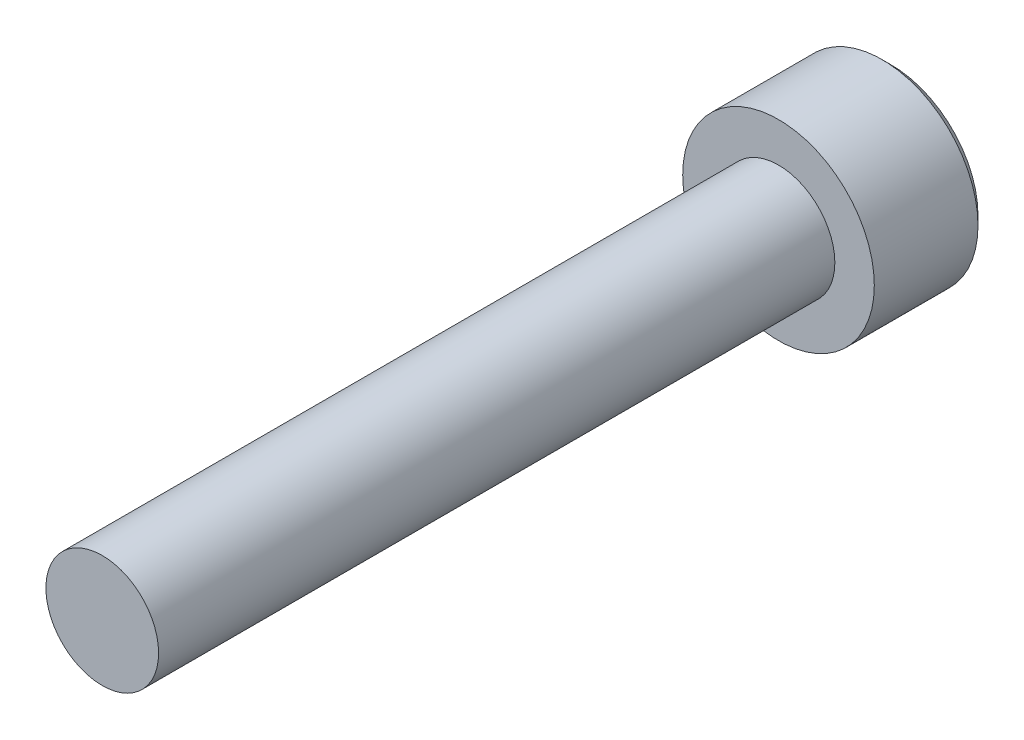
ISO-10303-21;
HEADER;
FILE_DESCRIPTION(('STEP AP214'),'2;1');
FILE_NAME('part.step','',(''),(''),'','','');
FILE_SCHEMA(('AUTOMOTIVE_DESIGN { 1 0 10303 214 1 1 1 1 }'));
ENDSEC;
DATA;
#1=APPLICATION_CONTEXT('core data for automotive mechanical design processes');
#2=APPLICATION_PROTOCOL_DEFINITION('international standard','automotive_design',2000,#1);
#3=PRODUCT_CONTEXT('',#1,'mechanical');
#4=PRODUCT('Part','Part','',(#3));
#5=PRODUCT_RELATED_PRODUCT_CATEGORY('part','',(#4));
#6=PRODUCT_DEFINITION_FORMATION('','',#4);
#7=PRODUCT_DEFINITION_CONTEXT('part definition',#1,'design');
#8=PRODUCT_DEFINITION('design','',#6,#7);
#9=PRODUCT_DEFINITION_SHAPE('','',#8);
#10=(LENGTH_UNIT() NAMED_UNIT(*) SI_UNIT(.MILLI.,.METRE.));
#11=(NAMED_UNIT(*) PLANE_ANGLE_UNIT() SI_UNIT($,.RADIAN.));
#12=(NAMED_UNIT(*) SI_UNIT($,.STERADIAN.) SOLID_ANGLE_UNIT());
#13=UNCERTAINTY_MEASURE_WITH_UNIT(LENGTH_MEASURE(1.E-05),#10,'distance_accuracy_value','');
#14=(GEOMETRIC_REPRESENTATION_CONTEXT(3) GLOBAL_UNCERTAINTY_ASSIGNED_CONTEXT((#13)) GLOBAL_UNIT_ASSIGNED_CONTEXT((#10,
#11,#12)) REPRESENTATION_CONTEXT('',''));
#15=CARTESIAN_POINT('',(0.,0.,0.));
#16=DIRECTION('',(0.,0.,1.));
#17=DIRECTION('',(1.,0.,0.));
#18=AXIS2_PLACEMENT_3D('',#15,#16,#17);
#19=CARTESIAN_POINT('',(0.,0.,0.));
#20=DIRECTION('',(0.,0.,1.));
#21=DIRECTION('',(1.,0.,0.));
#22=AXIS2_PLACEMENT_3D('',#19,#20,#21);
#23=PLANE('',#22);
#24=DIRECTION('',(0.5,-0.866025403784439,0.));
#25=VECTOR('',#24,1.);
#26=CARTESIAN_POINT('',(-1.50111069989303,-2.2,0.));
#27=LINE('',#26,#25);
#28=CARTESIAN_POINT('',(-2.77128129211021,0.,0.));
#29=VERTEX_POINT('',#28);
#30=CARTESIAN_POINT('',(-1.3856406460551,-2.4,0.));
#31=VERTEX_POINT('',#30);
#32=EDGE_CURVE('E163',#29,#31,#27,.T.);
#33=ORIENTED_EDGE('',*,*,#32,.T.);
#34=DIRECTION('',(1.,0.,0.));
#35=VECTOR('',#34,1.);
#36=CARTESIAN_POINT('',(1.15470053837925,-2.4,0.));
#37=LINE('',#36,#35);
#38=CARTESIAN_POINT('',(1.3856406460551,-2.4,0.));
#39=VERTEX_POINT('',#38);
#40=EDGE_CURVE('E165',#31,#39,#37,.T.);
#41=ORIENTED_EDGE('',*,*,#40,.T.);
#42=DIRECTION('',(0.5,0.866025403784439,0.));
#43=VECTOR('',#42,1.);
#44=CARTESIAN_POINT('',(2.65581123827228,-0.2,0.));
#45=LINE('',#44,#43);
#46=CARTESIAN_POINT('',(2.77128129211021,0.,0.));
#47=VERTEX_POINT('',#46);
#48=EDGE_CURVE('E155',#39,#47,#45,.T.);
#49=ORIENTED_EDGE('',*,*,#48,.T.);
#50=DIRECTION('',(-0.5,0.866025403784439,0.));
#51=VECTOR('',#50,1.);
#52=CARTESIAN_POINT('',(1.50111069989303,2.2,0.));
#53=LINE('',#52,#51);
#54=CARTESIAN_POINT('',(1.3856406460551,2.4,0.));
#55=VERTEX_POINT('',#54);
#56=EDGE_CURVE('E157',#47,#55,#53,.T.);
#57=ORIENTED_EDGE('',*,*,#56,.T.);
#58=DIRECTION('',(-1.,0.,0.));
#59=VECTOR('',#58,1.);
#60=CARTESIAN_POINT('',(-1.15470053837925,2.4,0.));
#61=LINE('',#60,#59);
#62=CARTESIAN_POINT('',(-1.3856406460551,2.4,0.));
#63=VERTEX_POINT('',#62);
#64=EDGE_CURVE('E159',#55,#63,#61,.T.);
#65=ORIENTED_EDGE('',*,*,#64,.T.);
#66=DIRECTION('',(-0.5,-0.866025403784439,0.));
#67=VECTOR('',#66,1.);
#68=CARTESIAN_POINT('',(-2.65581123827228,0.2,0.));
#69=LINE('',#68,#67);
#70=EDGE_CURVE('E161',#63,#29,#69,.T.);
#71=ORIENTED_EDGE('',*,*,#70,.T.);
#72=EDGE_LOOP('',(#33,#41,#49,#57,#65,#71));
#73=FACE_BOUND('',#72,.T.);
#74=CARTESIAN_POINT('',(0.,0.,0.));
#75=DIRECTION('',(0.,0.,1.));
#76=DIRECTION('',(1.,0.,0.));
#77=AXIS2_PLACEMENT_3D('',#74,#75,#76);
#78=CIRCLE('',#77,3.85);
#79=CARTESIAN_POINT('',(3.85,0.,0.));
#80=VERTEX_POINT('',#79);
#81=EDGE_CURVE('E150',#80,#80,#78,.F.);
#82=ORIENTED_EDGE('',*,*,#81,.T.);
#83=EDGE_LOOP('',(#82));
#84=FACE_BOUND('',#83,.T.);
#85=ADVANCED_FACE('F43',(#73,#84),#23,.F.);
#86=CARTESIAN_POINT('',(0.,0.,35.));
#87=DIRECTION('',(0.,0.,-1.));
#88=DIRECTION('',(-1.,0.,0.));
#89=AXIS2_PLACEMENT_3D('',#86,#87,#88);
#90=CYLINDRICAL_SURFACE('',#89,2.5);
#91=CARTESIAN_POINT('',(0.,0.,5.));
#92=DIRECTION('',(0.,0.,1.));
#93=DIRECTION('',(1.,0.,0.));
#94=AXIS2_PLACEMENT_3D('',#91,#92,#93);
#95=CIRCLE('',#94,2.5);
#96=CARTESIAN_POINT('',(2.5,0.,5.));
#97=VERTEX_POINT('',#96);
#98=EDGE_CURVE('E141',#97,#97,#95,.T.);
#99=ORIENTED_EDGE('',*,*,#98,.T.);
#100=EDGE_LOOP('',(#99));
#101=FACE_BOUND('',#100,.T.);
#102=CARTESIAN_POINT('',(0.,0.,35.));
#103=DIRECTION('',(0.,0.,1.));
#104=DIRECTION('',(1.,0.,0.));
#105=AXIS2_PLACEMENT_3D('',#102,#103,#104);
#106=CIRCLE('',#105,2.5);
#107=CARTESIAN_POINT('',(2.5,0.,35.));
#108=VERTEX_POINT('',#107);
#109=EDGE_CURVE('E147',#108,#108,#106,.T.);
#110=ORIENTED_EDGE('',*,*,#109,.F.);
#111=EDGE_LOOP('',(#110));
#112=FACE_BOUND('',#111,.T.);
#113=ADVANCED_FACE('F251',(#101,#112),#90,.T.);
#114=CARTESIAN_POINT('',(0.,0.,35.));
#115=DIRECTION('',(0.,0.,1.));
#116=DIRECTION('',(1.,0.,0.));
#117=AXIS2_PLACEMENT_3D('',#114,#115,#116);
#118=PLANE('',#117);
#119=ORIENTED_EDGE('',*,*,#109,.T.);
#120=EDGE_LOOP('',(#119));
#121=FACE_BOUND('',#120,.T.);
#122=ADVANCED_FACE('F259',(#121),#118,.T.);
#123=CARTESIAN_POINT('',(0.,0.,5.));
#124=DIRECTION('',(0.,0.,-1.));
#125=DIRECTION('',(-1.,0.,0.));
#126=AXIS2_PLACEMENT_3D('',#123,#124,#125);
#127=CYLINDRICAL_SURFACE('',#126,4.25);
#128=CARTESIAN_POINT('',(0.,0.,0.399999999999999));
#129=DIRECTION('',(0.,0.,1.));
#130=DIRECTION('',(1.,0.,0.));
#131=AXIS2_PLACEMENT_3D('',#128,#129,#130);
#132=CIRCLE('',#131,4.25);
#133=CARTESIAN_POINT('',(4.25,0.,0.399999999999999));
#134=VERTEX_POINT('',#133);
#135=EDGE_CURVE('E11',#134,#134,#132,.T.);
#136=ORIENTED_EDGE('',*,*,#135,.T.);
#137=EDGE_LOOP('',(#136));
#138=FACE_BOUND('',#137,.T.);
#139=CARTESIAN_POINT('',(0.,0.,5.));
#140=DIRECTION('',(0.,0.,1.));
#141=DIRECTION('',(1.,0.,0.));
#142=AXIS2_PLACEMENT_3D('',#139,#140,#141);
#143=CIRCLE('',#142,4.25);
#144=CARTESIAN_POINT('',(4.25,0.,5.));
#145=VERTEX_POINT('',#144);
#146=EDGE_CURVE('E137',#145,#145,#143,.T.);
#147=ORIENTED_EDGE('',*,*,#146,.F.);
#148=EDGE_LOOP('',(#147));
#149=FACE_BOUND('',#148,.T.);
#150=ADVANCED_FACE('F367',(#138,#149),#127,.T.);
#151=CARTESIAN_POINT('',(0.,0.,5.));
#152=DIRECTION('',(0.,0.,1.));
#153=DIRECTION('',(1.,0.,0.));
#154=AXIS2_PLACEMENT_3D('',#151,#152,#153);
#155=PLANE('',#154);
#156=ORIENTED_EDGE('',*,*,#98,.F.);
#157=EDGE_LOOP('',(#156));
#158=FACE_BOUND('',#157,.T.);
#159=ORIENTED_EDGE('',*,*,#146,.T.);
#160=EDGE_LOOP('',(#159));
#161=FACE_BOUND('',#160,.T.);
#162=ADVANCED_FACE('F369',(#158,#161),#155,.T.);
#163=CARTESIAN_POINT('',(1.15470053837925,-2.,3.));
#164=DIRECTION('',(-0.866025403784439,0.5,0.));
#165=DIRECTION('',(-0.5,-0.866025403784439,0.));
#166=AXIS2_PLACEMENT_3D('',#163,#164,#165);
#167=PLANE('',#166);
#168=DIRECTION('',(0.,0.,-1.));
#169=VECTOR('',#168,1.);
#170=CARTESIAN_POINT('',(2.3094010767585,0.,3.));
#171=LINE('',#170,#169);
#172=CARTESIAN_POINT('',(2.3094010767585,0.,3.));
#173=VERTEX_POINT('',#172);
#174=CARTESIAN_POINT('',(2.3094010767585,0.,0.400000000000001));
#175=VERTEX_POINT('',#174);
#176=EDGE_CURVE('E131',#173,#175,#171,.T.);
#177=ORIENTED_EDGE('',*,*,#176,.T.);
#178=DIRECTION('',(-0.5,-0.866025403784439,0.));
#179=VECTOR('',#178,1.);
#180=CARTESIAN_POINT('',(1.15470053837925,-2.,0.400000000000001));
#181=LINE('',#180,#179);
#182=CARTESIAN_POINT('',(1.15470053837925,-2.,0.400000000000001));
#183=VERTEX_POINT('',#182);
#184=EDGE_CURVE('E53',#175,#183,#181,.T.);
#185=ORIENTED_EDGE('',*,*,#184,.T.);
#186=DIRECTION('',(0.,0.,-1.));
#187=VECTOR('',#186,1.);
#188=CARTESIAN_POINT('',(1.15470053837925,-2.,3.));
#189=LINE('',#188,#187);
#190=CARTESIAN_POINT('',(1.15470053837925,-2.,3.));
#191=VERTEX_POINT('',#190);
#192=EDGE_CURVE('E134',#191,#183,#189,.T.);
#193=ORIENTED_EDGE('',*,*,#192,.F.);
#194=DIRECTION('',(0.5,0.866025403784439,0.));
#195=VECTOR('',#194,1.);
#196=CARTESIAN_POINT('',(1.15470053837925,-2.,3.));
#197=LINE('',#196,#195);
#198=EDGE_CURVE('E124',#191,#173,#197,.T.);
#199=ORIENTED_EDGE('',*,*,#198,.T.);
#200=EDGE_LOOP('',(#177,#185,#193,#199));
#201=FACE_BOUND('',#200,.T.);
#202=ADVANCED_FACE('F130',(#201),#167,.T.);
#203=CARTESIAN_POINT('',(2.3094010767585,0.,3.));
#204=DIRECTION('',(-0.866025403784439,-0.5,0.));
#205=DIRECTION('',(0.5,-0.866025403784439,0.));
#206=AXIS2_PLACEMENT_3D('',#203,#204,#205);
#207=PLANE('',#206);
#208=DIRECTION('',(0.,0.,-1.));
#209=VECTOR('',#208,1.);
#210=CARTESIAN_POINT('',(1.15470053837925,2.,3.));
#211=LINE('',#210,#209);
#212=CARTESIAN_POINT('',(1.15470053837925,2.,3.));
#213=VERTEX_POINT('',#212);
#214=CARTESIAN_POINT('',(1.15470053837925,2.,0.400000000000001));
#215=VERTEX_POINT('',#214);
#216=EDGE_CURVE('E138',#213,#215,#211,.T.);
#217=ORIENTED_EDGE('',*,*,#216,.T.);
#218=DIRECTION('',(0.5,-0.866025403784439,0.));
#219=VECTOR('',#218,1.);
#220=CARTESIAN_POINT('',(2.3094010767585,0.,0.400000000000001));
#221=LINE('',#220,#219);
#222=EDGE_CURVE('E61',#215,#175,#221,.T.);
#223=ORIENTED_EDGE('',*,*,#222,.T.);
#224=ORIENTED_EDGE('',*,*,#176,.F.);
#225=DIRECTION('',(-0.5,0.866025403784439,0.));
#226=VECTOR('',#225,1.);
#227=CARTESIAN_POINT('',(2.3094010767585,0.,3.));
#228=LINE('',#227,#226);
#229=EDGE_CURVE('E120',#173,#213,#228,.T.);
#230=ORIENTED_EDGE('',*,*,#229,.T.);
#231=EDGE_LOOP('',(#217,#223,#224,#230));
#232=FACE_BOUND('',#231,.T.);
#233=ADVANCED_FACE('F136',(#232),#207,.T.);
#234=CARTESIAN_POINT('',(1.15470053837925,2.,3.));
#235=DIRECTION('',(0.,-1.,0.));
#236=DIRECTION('',(0.,0.,-1.));
#237=AXIS2_PLACEMENT_3D('',#234,#235,#236);
#238=PLANE('',#237);
#239=DIRECTION('',(0.,0.,-1.));
#240=VECTOR('',#239,1.);
#241=CARTESIAN_POINT('',(-1.15470053837925,2.,3.));
#242=LINE('',#241,#240);
#243=CARTESIAN_POINT('',(-1.15470053837925,2.,3.));
#244=VERTEX_POINT('',#243);
#245=CARTESIAN_POINT('',(-1.15470053837925,2.,0.400000000000001));
#246=VERTEX_POINT('',#245);
#247=EDGE_CURVE('E143',#244,#246,#242,.T.);
#248=ORIENTED_EDGE('',*,*,#247,.T.);
#249=DIRECTION('',(1.,0.,0.));
#250=VECTOR('',#249,1.);
#251=CARTESIAN_POINT('',(1.15470053837925,2.,0.400000000000001));
#252=LINE('',#251,#250);
#253=EDGE_CURVE('E69',#246,#215,#252,.T.);
#254=ORIENTED_EDGE('',*,*,#253,.T.);
#255=ORIENTED_EDGE('',*,*,#216,.F.);
#256=DIRECTION('',(-1.,0.,0.));
#257=VECTOR('',#256,1.);
#258=CARTESIAN_POINT('',(1.15470053837925,2.,3.));
#259=LINE('',#258,#257);
#260=EDGE_CURVE('E126',#213,#244,#259,.T.);
#261=ORIENTED_EDGE('',*,*,#260,.T.);
#262=EDGE_LOOP('',(#248,#254,#255,#261));
#263=FACE_BOUND('',#262,.T.);
#264=ADVANCED_FACE('F241',(#263),#238,.T.);
#265=CARTESIAN_POINT('',(-1.15470053837925,2.,3.));
#266=DIRECTION('',(0.866025403784439,-0.5,0.));
#267=DIRECTION('',(0.5,0.866025403784439,0.));
#268=AXIS2_PLACEMENT_3D('',#265,#266,#267);
#269=PLANE('',#268);
#270=DIRECTION('',(0.,0.,-1.));
#271=VECTOR('',#270,1.);
#272=CARTESIAN_POINT('',(-2.3094010767585,0.,3.));
#273=LINE('',#272,#271);
#274=CARTESIAN_POINT('',(-2.3094010767585,0.,3.));
#275=VERTEX_POINT('',#274);
#276=CARTESIAN_POINT('',(-2.3094010767585,0.,0.400000000000001));
#277=VERTEX_POINT('',#276);
#278=EDGE_CURVE('E228',#275,#277,#273,.T.);
#279=ORIENTED_EDGE('',*,*,#278,.T.);
#280=DIRECTION('',(0.5,0.866025403784439,0.));
#281=VECTOR('',#280,1.);
#282=CARTESIAN_POINT('',(-1.15470053837925,2.,0.400000000000001));
#283=LINE('',#282,#281);
#284=EDGE_CURVE('E173',#277,#246,#283,.T.);
#285=ORIENTED_EDGE('',*,*,#284,.T.);
#286=ORIENTED_EDGE('',*,*,#247,.F.);
#287=DIRECTION('',(-0.5,-0.866025403784439,0.));
#288=VECTOR('',#287,1.);
#289=CARTESIAN_POINT('',(-1.15470053837925,2.,3.));
#290=LINE('',#289,#288);
#291=EDGE_CURVE('E233',#244,#275,#290,.T.);
#292=ORIENTED_EDGE('',*,*,#291,.T.);
#293=EDGE_LOOP('',(#279,#285,#286,#292));
#294=FACE_BOUND('',#293,.T.);
#295=ADVANCED_FACE('F231',(#294),#269,.T.);
#296=CARTESIAN_POINT('',(-2.3094010767585,0.,3.));
#297=DIRECTION('',(0.866025403784439,0.5,0.));
#298=DIRECTION('',(-0.5,0.866025403784439,0.));
#299=AXIS2_PLACEMENT_3D('',#296,#297,#298);
#300=PLANE('',#299);
#301=DIRECTION('',(0.,0.,-1.));
#302=VECTOR('',#301,1.);
#303=CARTESIAN_POINT('',(-1.15470053837925,-2.,3.));
#304=LINE('',#303,#302);
#305=CARTESIAN_POINT('',(-1.15470053837925,-2.,3.));
#306=VERTEX_POINT('',#305);
#307=CARTESIAN_POINT('',(-1.15470053837925,-2.,0.400000000000001));
#308=VERTEX_POINT('',#307);
#309=EDGE_CURVE('E214',#306,#308,#304,.T.);
#310=ORIENTED_EDGE('',*,*,#309,.T.);
#311=DIRECTION('',(-0.5,0.866025403784439,0.));
#312=VECTOR('',#311,1.);
#313=CARTESIAN_POINT('',(-2.3094010767585,0.,0.400000000000001));
#314=LINE('',#313,#312);
#315=EDGE_CURVE('E171',#308,#277,#314,.T.);
#316=ORIENTED_EDGE('',*,*,#315,.T.);
#317=ORIENTED_EDGE('',*,*,#278,.F.);
#318=DIRECTION('',(0.5,-0.866025403784439,0.));
#319=VECTOR('',#318,1.);
#320=CARTESIAN_POINT('',(-2.3094010767585,0.,3.));
#321=LINE('',#320,#319);
#322=EDGE_CURVE('E238',#275,#306,#321,.T.);
#323=ORIENTED_EDGE('',*,*,#322,.T.);
#324=EDGE_LOOP('',(#310,#316,#317,#323));
#325=FACE_BOUND('',#324,.T.);
#326=ADVANCED_FACE('F227',(#325),#300,.T.);
#327=CARTESIAN_POINT('',(-1.15470053837925,-2.,3.));
#328=DIRECTION('',(0.,1.,0.));
#329=DIRECTION('',(0.,0.,1.));
#330=AXIS2_PLACEMENT_3D('',#327,#328,#329);
#331=PLANE('',#330);
#332=ORIENTED_EDGE('',*,*,#192,.T.);
#333=DIRECTION('',(-1.,0.,0.));
#334=VECTOR('',#333,1.);
#335=CARTESIAN_POINT('',(-1.15470053837925,-2.,0.400000000000001));
#336=LINE('',#335,#334);
#337=EDGE_CURVE('E168',#183,#308,#336,.T.);
#338=ORIENTED_EDGE('',*,*,#337,.T.);
#339=ORIENTED_EDGE('',*,*,#309,.F.);
#340=DIRECTION('',(1.,0.,0.));
#341=VECTOR('',#340,1.);
#342=CARTESIAN_POINT('',(-1.15470053837925,-2.,3.));
#343=LINE('',#342,#341);
#344=EDGE_CURVE('E213',#306,#191,#343,.T.);
#345=ORIENTED_EDGE('',*,*,#344,.T.);
#346=EDGE_LOOP('',(#332,#338,#339,#345));
#347=FACE_BOUND('',#346,.T.);
#348=ADVANCED_FACE('F210',(#347),#331,.T.);
#349=CARTESIAN_POINT('',(0.,0.,3.));
#350=DIRECTION('',(0.,0.,1.));
#351=DIRECTION('',(1.,0.,0.));
#352=AXIS2_PLACEMENT_3D('',#349,#350,#351);
#353=PLANE('',#352);
#354=ORIENTED_EDGE('',*,*,#198,.F.);
#355=ORIENTED_EDGE('',*,*,#344,.F.);
#356=ORIENTED_EDGE('',*,*,#322,.F.);
#357=ORIENTED_EDGE('',*,*,#291,.F.);
#358=ORIENTED_EDGE('',*,*,#260,.F.);
#359=ORIENTED_EDGE('',*,*,#229,.F.);
#360=EDGE_LOOP('',(#354,#355,#356,#357,#358,#359));
#361=FACE_BOUND('',#360,.T.);
#362=ADVANCED_FACE('F122',(#361),#353,.F.);
#363=CARTESIAN_POINT('',(0.,2.4,0.));
#364=DIRECTION('',(0.,-0.707106781186547,-0.707106781186547));
#365=DIRECTION('',(1.,0.,0.));
#366=AXIS2_PLACEMENT_3D('',#363,#364,#365);
#367=PLANE('',#366);
#368=DIRECTION('',(0.377964473009228,0.654653670707977,-0.654653670707977));
#369=VECTOR('',#368,1.);
#370=CARTESIAN_POINT('',(1.18769198233295,2.05714285714286,0.342857142857143));
#371=LINE('',#370,#369);
#372=EDGE_CURVE('E187',#215,#55,#371,.T.);
#373=ORIENTED_EDGE('',*,*,#372,.F.);
#374=ORIENTED_EDGE('',*,*,#253,.F.);
#375=DIRECTION('',(-0.377964473009227,0.654653670707977,-0.654653670707977));
#376=VECTOR('',#375,1.);
#377=CARTESIAN_POINT('',(-1.18769198233294,2.05714285714286,0.342857142857143));
#378=LINE('',#377,#376);
#379=EDGE_CURVE('E48',#63,#246,#378,.F.);
#380=ORIENTED_EDGE('',*,*,#379,.F.);
#381=ORIENTED_EDGE('',*,*,#64,.F.);
#382=EDGE_LOOP('',(#373,#374,#380,#381));
#383=FACE_BOUND('',#382,.T.);
#384=ADVANCED_FACE('F201',(#383),#367,.T.);
#385=CARTESIAN_POINT('',(-2.07846096908265,1.2,0.));
#386=DIRECTION('',(0.612372435695795,-0.353553390593274,-0.707106781186547));
#387=DIRECTION('',(0.5,0.866025403784439,0.));
#388=AXIS2_PLACEMENT_3D('',#385,#386,#387);
#389=PLANE('',#388);
#390=ORIENTED_EDGE('',*,*,#379,.T.);
#391=ORIENTED_EDGE('',*,*,#284,.F.);
#392=DIRECTION('',(-0.755928946018454,0.,-0.654653670707977));
#393=VECTOR('',#392,1.);
#394=CARTESIAN_POINT('',(-2.37538396466589,0.,0.342857142857142));
#395=LINE('',#394,#393);
#396=EDGE_CURVE('E185',#29,#277,#395,.F.);
#397=ORIENTED_EDGE('',*,*,#396,.F.);
#398=ORIENTED_EDGE('',*,*,#70,.F.);
#399=EDGE_LOOP('',(#390,#391,#397,#398));
#400=FACE_BOUND('',#399,.T.);
#401=ADVANCED_FACE('F197',(#400),#389,.T.);
#402=CARTESIAN_POINT('',(2.07846096908265,1.2,0.));
#403=DIRECTION('',(-0.612372435695794,-0.353553390593274,-0.707106781186548));
#404=DIRECTION('',(0.5,-0.866025403784439,0.));
#405=AXIS2_PLACEMENT_3D('',#402,#403,#404);
#406=PLANE('',#405);
#407=ORIENTED_EDGE('',*,*,#372,.T.);
#408=ORIENTED_EDGE('',*,*,#56,.F.);
#409=DIRECTION('',(0.755928946018454,0.,-0.654653670707977));
#410=VECTOR('',#409,1.);
#411=CARTESIAN_POINT('',(2.37538396466589,0.,0.342857142857142));
#412=LINE('',#411,#410);
#413=EDGE_CURVE('E182',#175,#47,#412,.T.);
#414=ORIENTED_EDGE('',*,*,#413,.F.);
#415=ORIENTED_EDGE('',*,*,#222,.F.);
#416=EDGE_LOOP('',(#407,#408,#414,#415));
#417=FACE_BOUND('',#416,.T.);
#418=ADVANCED_FACE('F202',(#417),#406,.T.);
#419=CARTESIAN_POINT('',(-2.07846096908265,-1.2,0.));
#420=DIRECTION('',(0.612372435695794,0.353553390593274,-0.707106781186548));
#421=DIRECTION('',(-0.5,0.866025403784439,0.));
#422=AXIS2_PLACEMENT_3D('',#419,#420,#421);
#423=PLANE('',#422);
#424=ORIENTED_EDGE('',*,*,#396,.T.);
#425=ORIENTED_EDGE('',*,*,#315,.F.);
#426=DIRECTION('',(-0.377964473009228,-0.654653670707977,-0.654653670707977));
#427=VECTOR('',#426,1.);
#428=CARTESIAN_POINT('',(-1.18769198233295,-2.05714285714286,0.342857142857143));
#429=LINE('',#428,#427);
#430=EDGE_CURVE('E180',#31,#308,#429,.F.);
#431=ORIENTED_EDGE('',*,*,#430,.F.);
#432=ORIENTED_EDGE('',*,*,#32,.F.);
#433=EDGE_LOOP('',(#424,#425,#431,#432));
#434=FACE_BOUND('',#433,.T.);
#435=ADVANCED_FACE('F223',(#434),#423,.T.);
#436=CARTESIAN_POINT('',(2.07846096908265,-1.2,0.));
#437=DIRECTION('',(-0.612372435695795,0.353553390593274,-0.707106781186547));
#438=DIRECTION('',(-0.5,-0.866025403784439,0.));
#439=AXIS2_PLACEMENT_3D('',#436,#437,#438);
#440=PLANE('',#439);
#441=ORIENTED_EDGE('',*,*,#413,.T.);
#442=ORIENTED_EDGE('',*,*,#48,.F.);
#443=DIRECTION('',(-0.377964473009227,0.654653670707977,0.654653670707977));
#444=VECTOR('',#443,1.);
#445=CARTESIAN_POINT('',(1.18769198233295,-2.05714285714286,0.342857142857143));
#446=LINE('',#445,#444);
#447=EDGE_CURVE('E178',#183,#39,#446,.F.);
#448=ORIENTED_EDGE('',*,*,#447,.F.);
#449=ORIENTED_EDGE('',*,*,#184,.F.);
#450=EDGE_LOOP('',(#441,#442,#448,#449));
#451=FACE_BOUND('',#450,.T.);
#452=ADVANCED_FACE('F207',(#451),#440,.T.);
#453=CARTESIAN_POINT('',(0.,-2.4,0.));
#454=DIRECTION('',(0.,0.707106781186547,-0.707106781186547));
#455=DIRECTION('',(-1.,0.,0.));
#456=AXIS2_PLACEMENT_3D('',#453,#454,#455);
#457=PLANE('',#456);
#458=ORIENTED_EDGE('',*,*,#430,.T.);
#459=ORIENTED_EDGE('',*,*,#337,.F.);
#460=ORIENTED_EDGE('',*,*,#447,.T.);
#461=ORIENTED_EDGE('',*,*,#40,.F.);
#462=EDGE_LOOP('',(#458,#459,#460,#461));
#463=FACE_BOUND('',#462,.T.);
#464=ADVANCED_FACE('F217',(#463),#457,.T.);
#465=CARTESIAN_POINT('',(0.,0.,0.399999999999999));
#466=DIRECTION('',(0.,0.,1.));
#467=DIRECTION('',(1.,0.,0.));
#468=AXIS2_PLACEMENT_3D('',#465,#466,#467);
#469=CONICAL_SURFACE('',#468,4.25,0.78539816339745);
#470=CARTESIAN_POINT('',(3.85,0.,0.));
#471=CARTESIAN_POINT('',(3.85416666666667,0.,0.00416666666666656));
#472=CARTESIAN_POINT('',(3.85833333333333,0.,0.00833333333333324));
#473=CARTESIAN_POINT('',(3.86666666666667,0.,0.0166666666666666));
#474=CARTESIAN_POINT('',(3.87083333333333,0.,0.0208333333333333));
#475=CARTESIAN_POINT('',(3.87916666666667,0.,0.0291666666666666));
#476=CARTESIAN_POINT('',(3.88333333333333,0.,0.0333333333333332));
#477=CARTESIAN_POINT('',(3.89166666666667,0.,0.0416666666666665));
#478=CARTESIAN_POINT('',(3.89583333333333,0.,0.0458333333333332));
#479=CARTESIAN_POINT('',(3.90416666666667,0.,0.0541666666666666));
#480=CARTESIAN_POINT('',(3.90833333333333,0.,0.0583333333333332));
#481=CARTESIAN_POINT('',(3.91666666666667,0.,0.0666666666666665));
#482=CARTESIAN_POINT('',(3.92083333333333,0.,0.0708333333333331));
#483=CARTESIAN_POINT('',(3.92916666666667,0.,0.0791666666666664));
#484=CARTESIAN_POINT('',(3.93333333333333,0.,0.0833333333333332));
#485=CARTESIAN_POINT('',(3.94166666666667,0.,0.0916666666666666));
#486=CARTESIAN_POINT('',(3.94583333333333,0.,0.0958333333333332));
#487=CARTESIAN_POINT('',(3.95416666666667,0.,0.104166666666666));
#488=CARTESIAN_POINT('',(3.95833333333333,0.,0.108333333333333));
#489=CARTESIAN_POINT('',(3.96666666666667,0.,0.116666666666666));
#490=CARTESIAN_POINT('',(3.97083333333333,0.,0.120833333333333));
#491=CARTESIAN_POINT('',(3.97916666666667,0.,0.129166666666666));
#492=CARTESIAN_POINT('',(3.98333333333333,0.,0.133333333333333));
#493=CARTESIAN_POINT('',(3.99166666666667,0.,0.141666666666666));
#494=CARTESIAN_POINT('',(3.99583333333333,0.,0.145833333333333));
#495=CARTESIAN_POINT('',(4.00416666666667,0.,0.154166666666666));
#496=CARTESIAN_POINT('',(4.00833333333333,0.,0.158333333333333));
#497=CARTESIAN_POINT('',(4.01666666666667,0.,0.166666666666666));
#498=CARTESIAN_POINT('',(4.02083333333333,0.,0.170833333333333));
#499=CARTESIAN_POINT('',(4.02916666666667,0.,0.179166666666666));
#500=CARTESIAN_POINT('',(4.03333333333333,0.,0.183333333333333));
#501=CARTESIAN_POINT('',(4.04166666666667,0.,0.191666666666666));
#502=CARTESIAN_POINT('',(4.04583333333333,0.,0.195833333333333));
#503=CARTESIAN_POINT('',(4.05416666666667,0.,0.204166666666666));
#504=CARTESIAN_POINT('',(4.05833333333333,0.,0.208333333333333));
#505=CARTESIAN_POINT('',(4.06666666666667,0.,0.216666666666666));
#506=CARTESIAN_POINT('',(4.07083333333333,0.,0.220833333333333));
#507=CARTESIAN_POINT('',(4.07916666666667,0.,0.229166666666666));
#508=CARTESIAN_POINT('',(4.08333333333333,0.,0.233333333333333));
#509=CARTESIAN_POINT('',(4.09166666666667,0.,0.241666666666666));
#510=CARTESIAN_POINT('',(4.09583333333333,0.,0.245833333333333));
#511=CARTESIAN_POINT('',(4.10416666666667,0.,0.254166666666666));
#512=CARTESIAN_POINT('',(4.10833333333333,0.,0.258333333333333));
#513=CARTESIAN_POINT('',(4.11666666666667,0.,0.266666666666666));
#514=CARTESIAN_POINT('',(4.12083333333333,0.,0.270833333333333));
#515=CARTESIAN_POINT('',(4.12916666666667,0.,0.279166666666666));
#516=CARTESIAN_POINT('',(4.13333333333333,0.,0.283333333333333));
#517=CARTESIAN_POINT('',(4.14166666666667,0.,0.291666666666666));
#518=CARTESIAN_POINT('',(4.14583333333333,0.,0.295833333333333));
#519=CARTESIAN_POINT('',(4.15416666666667,0.,0.304166666666666));
#520=CARTESIAN_POINT('',(4.15833333333333,0.,0.308333333333333));
#521=CARTESIAN_POINT('',(4.16666666666667,0.,0.316666666666666));
#522=CARTESIAN_POINT('',(4.17083333333333,0.,0.320833333333333));
#523=CARTESIAN_POINT('',(4.17916666666667,0.,0.329166666666666));
#524=CARTESIAN_POINT('',(4.18333333333333,0.,0.333333333333333));
#525=CARTESIAN_POINT('',(4.19166666666667,0.,0.341666666666666));
#526=CARTESIAN_POINT('',(4.19583333333333,0.,0.345833333333333));
#527=CARTESIAN_POINT('',(4.20416666666667,0.,0.354166666666666));
#528=CARTESIAN_POINT('',(4.20833333333333,0.,0.358333333333333));
#529=CARTESIAN_POINT('',(4.21666666666667,0.,0.366666666666666));
#530=CARTESIAN_POINT('',(4.22083333333333,0.,0.370833333333333));
#531=CARTESIAN_POINT('',(4.22916666666667,0.,0.379166666666666));
#532=CARTESIAN_POINT('',(4.23333333333333,0.,0.383333333333333));
#533=CARTESIAN_POINT('',(4.24166666666667,0.,0.391666666666666));
#534=CARTESIAN_POINT('',(4.24583333333333,0.,0.395833333333333));
#535=CARTESIAN_POINT('',(4.25,0.,0.399999999999999));
#536=B_SPLINE_CURVE_WITH_KNOTS('',3,(#470,#471,#472,#473,#474,#475,#476,#477,#478,#479,#480,
#481,#482,#483,#484,#485,#486,#487,#488,#489,#490,#491,#492,#493,#494,#495,#496,#497,#498,#499,
#500,#501,#502,#503,#504,#505,#506,#507,#508,#509,#510,#511,#512,#513,#514,#515,#516,#517,#518,
#519,#520,#521,#522,#523,#524,#525,#526,#527,#528,#529,#530,#531,#532,#533,#534,#535),
.UNSPECIFIED.,.F.,.F.,(4,2,2,2,2,2,2,2,2,2,2,2,2,2,2,2,2,2,2,2,2,2,2,2,2,2,2,2,2,2,2,2,4),(0.,
0.0176776695296636,0.0353553390593272,0.0530330085889912,0.0707106781186548,0.0883883476483184,
0.106066017177982,0.123743686707646,0.14142135623731,0.159099025766974,0.176776695296637,
0.194454364826301,0.212132034355965,0.229809703885628,0.247487373415292,0.265165042944955,
0.282842712474619,0.300520382004283,0.318198051533946,0.33587572106361,0.353553390593274,
0.371231060122938,0.388908729652602,0.406586399182265,0.424264068711929,0.441941738241593,
0.459619407771256,0.47729707730092,0.494974746830584,0.512652416360247,0.530330085889911,
0.548007755419574,0.565685424949238),.UNSPECIFIED.);
#537=EDGE_CURVE('BSEAM46',#80,#134,#536,.T.);
#538=ORIENTED_EDGE('',*,*,#81,.F.);
#539=ORIENTED_EDGE('',*,*,#135,.F.);
#540=ORIENTED_EDGE('',*,*,#537,.T.);
#541=ORIENTED_EDGE('',*,*,#537,.F.);
#542=EDGE_LOOP('',(#538,#540,#539,#541));
#543=FACE_BOUND('',#542,.T.);
#544=ADVANCED_FACE('F46',(#543),#469,.T.);
#545=CLOSED_SHELL('',(#85,#113,#122,#150,#162,#202,#233,#264,#295,#326,#348,#362,#384,#401,#418,
#435,#452,#464,#544));
#546=MANIFOLD_SOLID_BREP('B2',#545);
#547=ADVANCED_BREP_SHAPE_REPRESENTATION('',(#18,#546),#14);
#548=SHAPE_DEFINITION_REPRESENTATION(#9,#547);
ENDSEC;
END-ISO-10303-21;
